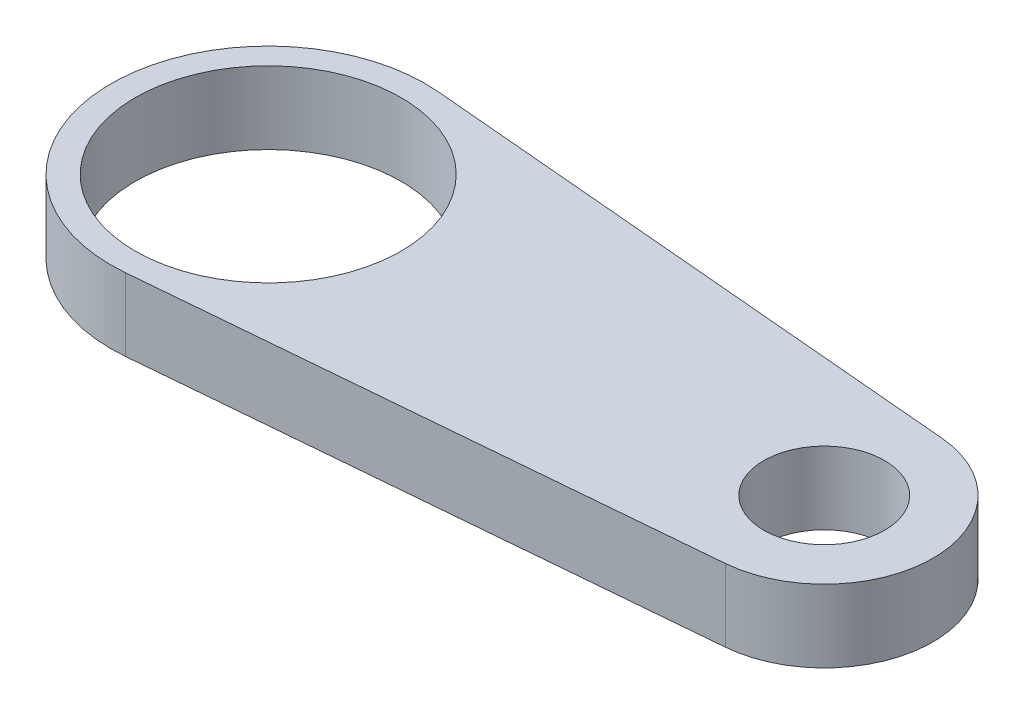
ISO-10303-21;
HEADER;
FILE_DESCRIPTION(('STEP AP214'),'2;1');
FILE_NAME('part.step','',(''),(''),'','','');
FILE_SCHEMA(('AUTOMOTIVE_DESIGN { 1 0 10303 214 1 1 1 1 }'));
ENDSEC;
DATA;
#1=APPLICATION_CONTEXT('core data for automotive mechanical design processes');
#2=APPLICATION_PROTOCOL_DEFINITION('international standard','automotive_design',2000,#1);
#3=PRODUCT_CONTEXT('',#1,'mechanical');
#4=PRODUCT('Part','Part','',(#3));
#5=PRODUCT_RELATED_PRODUCT_CATEGORY('part','',(#4));
#6=PRODUCT_DEFINITION_FORMATION('','',#4);
#7=PRODUCT_DEFINITION_CONTEXT('part definition',#1,'design');
#8=PRODUCT_DEFINITION('design','',#6,#7);
#9=PRODUCT_DEFINITION_SHAPE('','',#8);
#10=(LENGTH_UNIT() NAMED_UNIT(*) SI_UNIT(.MILLI.,.METRE.));
#11=(NAMED_UNIT(*) PLANE_ANGLE_UNIT() SI_UNIT($,.RADIAN.));
#12=(NAMED_UNIT(*) SI_UNIT($,.STERADIAN.) SOLID_ANGLE_UNIT());
#13=UNCERTAINTY_MEASURE_WITH_UNIT(LENGTH_MEASURE(1.E-05),#10,'distance_accuracy_value','');
#14=(GEOMETRIC_REPRESENTATION_CONTEXT(3) GLOBAL_UNCERTAINTY_ASSIGNED_CONTEXT((#13)) GLOBAL_UNIT_ASSIGNED_CONTEXT((#10,
#11,#12)) REPRESENTATION_CONTEXT('',''));
#15=CARTESIAN_POINT('',(0.,0.,0.));
#16=DIRECTION('',(0.,0.,1.));
#17=DIRECTION('',(1.,0.,0.));
#18=AXIS2_PLACEMENT_3D('',#15,#16,#17);
#19=CARTESIAN_POINT('',(0.,12.,0.));
#20=DIRECTION('',(0.,1.,0.));
#21=DIRECTION('',(0.,0.,1.));
#22=AXIS2_PLACEMENT_3D('',#19,#20,#21);
#23=PLANE('',#22);
#24=CARTESIAN_POINT('',(0.,12.,0.));
#25=DIRECTION('',(0.,1.,0.));
#26=DIRECTION('',(0.,0.,1.));
#27=AXIS2_PLACEMENT_3D('',#24,#25,#26);
#28=CIRCLE('',#27,22.);
#29=CARTESIAN_POINT('',(0.,12.,22.));
#30=VERTEX_POINT('',#29);
#31=EDGE_CURVE('E99',#30,#30,#28,.T.);
#32=ORIENTED_EDGE('',*,*,#31,.F.);
#33=EDGE_LOOP('',(#32));
#34=FACE_BOUND('',#33,.T.);
#35=CARTESIAN_POINT('',(0.,12.,0.));
#36=DIRECTION('',(0.,1.,0.));
#37=DIRECTION('',(0.,0.,1.));
#38=AXIS2_PLACEMENT_3D('',#35,#36,#37);
#39=CIRCLE('',#38,26.);
#40=CARTESIAN_POINT('',(2.26086956521739,12.,-25.9015147975765));
#41=VERTEX_POINT('',#40);
#42=CARTESIAN_POINT('',(2.26086956521739,12.,25.9015147975765));
#43=VERTEX_POINT('',#42);
#44=EDGE_CURVE('E84',#41,#43,#39,.T.);
#45=ORIENTED_EDGE('',*,*,#44,.T.);
#46=DIRECTION('',(0.996212107599096,0.,-0.0869565217391304));
#47=VECTOR('',#46,1.);
#48=CARTESIAN_POINT('',(2.26086956521739,12.,25.9015147975765));
#49=LINE('',#48,#47);
#50=CARTESIAN_POINT('',(93.5652173913043,12.,17.9318179367837));
#51=VERTEX_POINT('',#50);
#52=EDGE_CURVE('E79',#43,#51,#49,.T.);
#53=ORIENTED_EDGE('',*,*,#52,.T.);
#54=CARTESIAN_POINT('',(92.,12.,0.));
#55=DIRECTION('',(0.,1.,0.));
#56=DIRECTION('',(0.,0.,1.));
#57=AXIS2_PLACEMENT_3D('',#54,#55,#56);
#58=CIRCLE('',#57,18.);
#59=CARTESIAN_POINT('',(93.5652173913043,12.,-17.9318179367837));
#60=VERTEX_POINT('',#59);
#61=EDGE_CURVE('E82',#51,#60,#58,.T.);
#62=ORIENTED_EDGE('',*,*,#61,.T.);
#63=DIRECTION('',(-0.996212107599096,0.,-0.0869565217391304));
#64=VECTOR('',#63,1.);
#65=CARTESIAN_POINT('',(2.26086956521739,12.,-25.9015147975765));
#66=LINE('',#65,#64);
#67=EDGE_CURVE('E49',#60,#41,#66,.T.);
#68=ORIENTED_EDGE('',*,*,#67,.T.);
#69=EDGE_LOOP('',(#45,#53,#62,#68));
#70=FACE_BOUND('',#69,.T.);
#71=CARTESIAN_POINT('',(92.,12.,0.));
#72=DIRECTION('',(0.,1.,0.));
#73=DIRECTION('',(0.,0.,1.));
#74=AXIS2_PLACEMENT_3D('',#71,#72,#73);
#75=CIRCLE('',#74,10.);
#76=CARTESIAN_POINT('',(92.,12.,10.));
#77=VERTEX_POINT('',#76);
#78=EDGE_CURVE('E114',#77,#77,#75,.T.);
#79=ORIENTED_EDGE('',*,*,#78,.F.);
#80=EDGE_LOOP('',(#79));
#81=FACE_BOUND('',#80,.T.);
#82=ADVANCED_FACE('F32',(#34,#70,#81),#23,.T.);
#83=CARTESIAN_POINT('',(0.,0.,0.));
#84=DIRECTION('',(0.,1.,0.));
#85=DIRECTION('',(0.,0.,1.));
#86=AXIS2_PLACEMENT_3D('',#83,#84,#85);
#87=PLANE('',#86);
#88=CARTESIAN_POINT('',(0.,0.,0.));
#89=DIRECTION('',(0.,1.,0.));
#90=DIRECTION('',(0.,0.,1.));
#91=AXIS2_PLACEMENT_3D('',#88,#89,#90);
#92=CIRCLE('',#91,26.);
#93=CARTESIAN_POINT('',(2.26086956521739,0.,-25.9015147975765));
#94=VERTEX_POINT('',#93);
#95=CARTESIAN_POINT('',(2.26086956521739,0.,25.9015147975765));
#96=VERTEX_POINT('',#95);
#97=EDGE_CURVE('E96',#94,#96,#92,.T.);
#98=ORIENTED_EDGE('',*,*,#97,.F.);
#99=DIRECTION('',(-0.996212107599096,0.,-0.0869565217391304));
#100=VECTOR('',#99,1.);
#101=CARTESIAN_POINT('',(2.26086956521739,0.,-25.9015147975765));
#102=LINE('',#101,#100);
#103=CARTESIAN_POINT('',(93.5652173913043,0.,-17.9318179367837));
#104=VERTEX_POINT('',#103);
#105=EDGE_CURVE('E72',#104,#94,#102,.T.);
#106=ORIENTED_EDGE('',*,*,#105,.F.);
#107=CARTESIAN_POINT('',(92.,0.,0.));
#108=DIRECTION('',(0.,1.,0.));
#109=DIRECTION('',(0.,0.,1.));
#110=AXIS2_PLACEMENT_3D('',#107,#108,#109);
#111=CIRCLE('',#110,18.);
#112=CARTESIAN_POINT('',(93.5652173913043,0.,17.9318179367837));
#113=VERTEX_POINT('',#112);
#114=EDGE_CURVE('E66',#113,#104,#111,.T.);
#115=ORIENTED_EDGE('',*,*,#114,.F.);
#116=DIRECTION('',(0.996212107599096,0.,-0.0869565217391304));
#117=VECTOR('',#116,1.);
#118=CARTESIAN_POINT('',(2.26086956521739,0.,25.9015147975765));
#119=LINE('',#118,#117);
#120=EDGE_CURVE('E88',#96,#113,#119,.T.);
#121=ORIENTED_EDGE('',*,*,#120,.F.);
#122=EDGE_LOOP('',(#98,#106,#115,#121));
#123=FACE_BOUND('',#122,.T.);
#124=CARTESIAN_POINT('',(0.,0.,0.));
#125=DIRECTION('',(0.,1.,0.));
#126=DIRECTION('',(0.,0.,1.));
#127=AXIS2_PLACEMENT_3D('',#124,#125,#126);
#128=CIRCLE('',#127,22.);
#129=CARTESIAN_POINT('',(0.,0.,22.));
#130=VERTEX_POINT('',#129);
#131=EDGE_CURVE('E111',#130,#130,#128,.T.);
#132=ORIENTED_EDGE('',*,*,#131,.T.);
#133=EDGE_LOOP('',(#132));
#134=FACE_BOUND('',#133,.T.);
#135=CARTESIAN_POINT('',(92.,0.,0.));
#136=DIRECTION('',(0.,1.,0.));
#137=DIRECTION('',(0.,0.,1.));
#138=AXIS2_PLACEMENT_3D('',#135,#136,#137);
#139=CIRCLE('',#138,10.);
#140=CARTESIAN_POINT('',(92.,0.,10.));
#141=VERTEX_POINT('',#140);
#142=EDGE_CURVE('E117',#141,#141,#139,.T.);
#143=ORIENTED_EDGE('',*,*,#142,.T.);
#144=EDGE_LOOP('',(#143));
#145=FACE_BOUND('',#144,.T.);
#146=ADVANCED_FACE('F107',(#123,#134,#145),#87,.F.);
#147=CARTESIAN_POINT('',(0.,12.,0.));
#148=DIRECTION('',(0.,-1.,0.));
#149=DIRECTION('',(0.,0.,-1.));
#150=AXIS2_PLACEMENT_3D('',#147,#148,#149);
#151=CYLINDRICAL_SURFACE('',#150,26.);
#152=ORIENTED_EDGE('',*,*,#97,.T.);
#153=DIRECTION('',(0.,-1.,0.));
#154=VECTOR('',#153,1.);
#155=CARTESIAN_POINT('',(2.26086956521739,12.,25.9015147975765));
#156=LINE('',#155,#154);
#157=EDGE_CURVE('E11',#43,#96,#156,.T.);
#158=ORIENTED_EDGE('',*,*,#157,.F.);
#159=ORIENTED_EDGE('',*,*,#44,.F.);
#160=DIRECTION('',(0.,-1.,0.));
#161=VECTOR('',#160,1.);
#162=CARTESIAN_POINT('',(2.26086956521739,12.,-25.9015147975765));
#163=LINE('',#162,#161);
#164=EDGE_CURVE('E92',#41,#94,#163,.T.);
#165=ORIENTED_EDGE('',*,*,#164,.T.);
#166=EDGE_LOOP('',(#152,#158,#159,#165));
#167=FACE_BOUND('',#166,.T.);
#168=ADVANCED_FACE('F34',(#167),#151,.T.);
#169=CARTESIAN_POINT('',(2.26086956521739,12.,25.9015147975765));
#170=DIRECTION('',(-0.0869565217391304,0.,-0.996212107599096));
#171=DIRECTION('',(-0.996212107599096,0.,0.0869565217391304));
#172=AXIS2_PLACEMENT_3D('',#169,#170,#171);
#173=PLANE('',#172);
#174=ORIENTED_EDGE('',*,*,#120,.T.);
#175=DIRECTION('',(0.,-1.,0.));
#176=VECTOR('',#175,1.);
#177=CARTESIAN_POINT('',(93.5652173913043,12.,17.9318179367837));
#178=LINE('',#177,#176);
#179=EDGE_CURVE('E41',#51,#113,#178,.T.);
#180=ORIENTED_EDGE('',*,*,#179,.F.);
#181=ORIENTED_EDGE('',*,*,#52,.F.);
#182=ORIENTED_EDGE('',*,*,#157,.T.);
#183=EDGE_LOOP('',(#174,#180,#181,#182));
#184=FACE_BOUND('',#183,.T.);
#185=ADVANCED_FACE('F87',(#184),#173,.F.);
#186=CARTESIAN_POINT('',(92.,12.,0.));
#187=DIRECTION('',(0.,-1.,0.));
#188=DIRECTION('',(0.,0.,-1.));
#189=AXIS2_PLACEMENT_3D('',#186,#187,#188);
#190=CYLINDRICAL_SURFACE('',#189,18.);
#191=ORIENTED_EDGE('',*,*,#114,.T.);
#192=DIRECTION('',(0.,-1.,0.));
#193=VECTOR('',#192,1.);
#194=CARTESIAN_POINT('',(93.5652173913043,12.,-17.9318179367837));
#195=LINE('',#194,#193);
#196=EDGE_CURVE('E89',#60,#104,#195,.T.);
#197=ORIENTED_EDGE('',*,*,#196,.F.);
#198=ORIENTED_EDGE('',*,*,#61,.F.);
#199=ORIENTED_EDGE('',*,*,#179,.T.);
#200=EDGE_LOOP('',(#191,#197,#198,#199));
#201=FACE_BOUND('',#200,.T.);
#202=ADVANCED_FACE('F90',(#201),#190,.T.);
#203=CARTESIAN_POINT('',(2.26086956521739,12.,-25.9015147975765));
#204=DIRECTION('',(-0.0869565217391304,0.,0.996212107599096));
#205=DIRECTION('',(0.996212107599096,0.,0.0869565217391304));
#206=AXIS2_PLACEMENT_3D('',#203,#204,#205);
#207=PLANE('',#206);
#208=ORIENTED_EDGE('',*,*,#105,.T.);
#209=ORIENTED_EDGE('',*,*,#164,.F.);
#210=ORIENTED_EDGE('',*,*,#67,.F.);
#211=ORIENTED_EDGE('',*,*,#196,.T.);
#212=EDGE_LOOP('',(#208,#209,#210,#211));
#213=FACE_BOUND('',#212,.T.);
#214=ADVANCED_FACE('F104',(#213),#207,.F.);
#215=CARTESIAN_POINT('',(0.,12.,0.));
#216=DIRECTION('',(0.,-1.,0.));
#217=DIRECTION('',(0.,0.,-1.));
#218=AXIS2_PLACEMENT_3D('',#215,#216,#217);
#219=CYLINDRICAL_SURFACE('',#218,22.);
#220=ORIENTED_EDGE('',*,*,#31,.T.);
#221=EDGE_LOOP('',(#220));
#222=FACE_BOUND('',#221,.T.);
#223=ORIENTED_EDGE('',*,*,#131,.F.);
#224=EDGE_LOOP('',(#223));
#225=FACE_BOUND('',#224,.T.);
#226=ADVANCED_FACE('F134',(#222,#225),#219,.F.);
#227=CARTESIAN_POINT('',(92.,12.,0.));
#228=DIRECTION('',(0.,-1.,0.));
#229=DIRECTION('',(0.,0.,-1.));
#230=AXIS2_PLACEMENT_3D('',#227,#228,#229);
#231=CYLINDRICAL_SURFACE('',#230,10.);
#232=ORIENTED_EDGE('',*,*,#78,.T.);
#233=EDGE_LOOP('',(#232));
#234=FACE_BOUND('',#233,.T.);
#235=ORIENTED_EDGE('',*,*,#142,.F.);
#236=EDGE_LOOP('',(#235));
#237=FACE_BOUND('',#236,.T.);
#238=ADVANCED_FACE('F123',(#234,#237),#231,.F.);
#239=CLOSED_SHELL('',(#82,#146,#168,#185,#202,#214,#226,#238));
#240=MANIFOLD_SOLID_BREP('B2',#239);
#241=ADVANCED_BREP_SHAPE_REPRESENTATION('',(#18,#240),#14);
#242=SHAPE_DEFINITION_REPRESENTATION(#9,#241);
ENDSEC;
END-ISO-10303-21;
